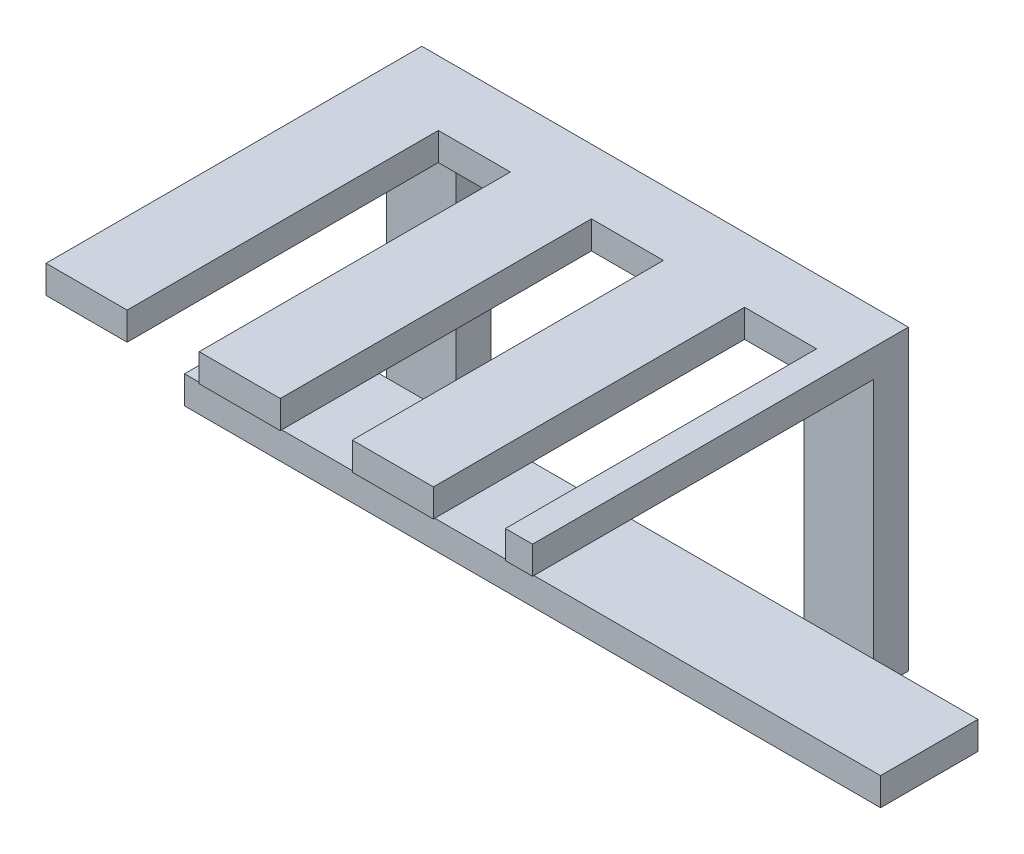
ISO-10303-21;
HEADER;
FILE_DESCRIPTION(('STEP AP214'),'2;1');
FILE_NAME('part.step','',(''),(''),'','','');
FILE_SCHEMA(('AUTOMOTIVE_DESIGN { 1 0 10303 214 1 1 1 1 }'));
ENDSEC;
DATA;
#1=APPLICATION_CONTEXT('core data for automotive mechanical design processes');
#2=APPLICATION_PROTOCOL_DEFINITION('international standard','automotive_design',2000,#1);
#3=PRODUCT_CONTEXT('',#1,'mechanical');
#4=PRODUCT('Part','Part','',(#3));
#5=PRODUCT_RELATED_PRODUCT_CATEGORY('part','',(#4));
#6=PRODUCT_DEFINITION_FORMATION('','',#4);
#7=PRODUCT_DEFINITION_CONTEXT('part definition',#1,'design');
#8=PRODUCT_DEFINITION('design','',#6,#7);
#9=PRODUCT_DEFINITION_SHAPE('','',#8);
#10=(LENGTH_UNIT() NAMED_UNIT(*) SI_UNIT(.MILLI.,.METRE.));
#11=(NAMED_UNIT(*) PLANE_ANGLE_UNIT() SI_UNIT($,.RADIAN.));
#12=(NAMED_UNIT(*) SI_UNIT($,.STERADIAN.) SOLID_ANGLE_UNIT());
#13=UNCERTAINTY_MEASURE_WITH_UNIT(LENGTH_MEASURE(1.E-05),#10,'distance_accuracy_value','');
#14=(GEOMETRIC_REPRESENTATION_CONTEXT(3) GLOBAL_UNCERTAINTY_ASSIGNED_CONTEXT((#13)) GLOBAL_UNIT_ASSIGNED_CONTEXT((#10,
#11,#12)) REPRESENTATION_CONTEXT('',''));
#15=CARTESIAN_POINT('',(0.,0.,0.));
#16=DIRECTION('',(0.,0.,1.));
#17=DIRECTION('',(1.,0.,0.));
#18=AXIS2_PLACEMENT_3D('',#15,#16,#17);
#19=CARTESIAN_POINT('',(0.,0.,42.));
#20=DIRECTION('',(0.,0.,1.));
#21=DIRECTION('',(1.,0.,0.));
#22=AXIS2_PLACEMENT_3D('',#19,#20,#21);
#23=PLANE('',#22);
#24=DIRECTION('',(0.,-1.,0.));
#25=VECTOR('',#24,1.);
#26=CARTESIAN_POINT('',(-23.2454142474019,0.,42.));
#27=LINE('',#26,#25);
#28=CARTESIAN_POINT('',(-23.2454142474019,42.8,42.));
#29=VERTEX_POINT('',#28);
#30=CARTESIAN_POINT('',(-23.2454142474019,38.8,42.));
#31=VERTEX_POINT('',#30);
#32=EDGE_CURVE('E243',#29,#31,#27,.T.);
#33=ORIENTED_EDGE('',*,*,#32,.F.);
#34=DIRECTION('',(1.,0.,0.));
#35=VECTOR('',#34,1.);
#36=CARTESIAN_POINT('',(35.,42.8,42.));
#37=LINE('',#36,#35);
#38=CARTESIAN_POINT('',(-34.9045561896725,42.8,42.));
#39=VERTEX_POINT('',#38);
#40=EDGE_CURVE('E259',#39,#29,#37,.T.);
#41=ORIENTED_EDGE('',*,*,#40,.F.);
#42=DIRECTION('',(0.,1.,0.));
#43=VECTOR('',#42,1.);
#44=CARTESIAN_POINT('',(-34.9045561896725,38.8,42.));
#45=LINE('',#44,#43);
#46=CARTESIAN_POINT('',(-34.9045561896725,38.8,42.));
#47=VERTEX_POINT('',#46);
#48=EDGE_CURVE('E284',#47,#39,#45,.T.);
#49=ORIENTED_EDGE('',*,*,#48,.F.);
#50=DIRECTION('',(-1.,0.,0.));
#51=VECTOR('',#50,1.);
#52=CARTESIAN_POINT('',(35.,38.8,42.));
#53=LINE('',#52,#51);
#54=EDGE_CURVE('E260',#31,#47,#53,.T.);
#55=ORIENTED_EDGE('',*,*,#54,.F.);
#56=EDGE_LOOP('',(#33,#41,#49,#55));
#57=FACE_BOUND('',#56,.T.);
#58=ADVANCED_FACE('F45',(#57),#23,.T.);
#59=DIRECTION('',(0.,1.,0.));
#60=VECTOR('',#59,1.);
#61=CARTESIAN_POINT('',(-12.8979257736368,0.,42.));
#62=LINE('',#61,#60);
#63=CARTESIAN_POINT('',(-12.8979257736368,38.8,42.));
#64=VERTEX_POINT('',#63);
#65=CARTESIAN_POINT('',(-12.8979257736368,42.8,42.));
#66=VERTEX_POINT('',#65);
#67=EDGE_CURVE('E263',#64,#66,#62,.T.);
#68=ORIENTED_EDGE('',*,*,#67,.F.);
#69=CARTESIAN_POINT('',(-1.24541424740194,38.8,42.));
#70=VERTEX_POINT('',#69);
#71=EDGE_CURVE('E376',#70,#64,#53,.T.);
#72=ORIENTED_EDGE('',*,*,#71,.F.);
#73=DIRECTION('',(0.,-1.,0.));
#74=VECTOR('',#73,1.);
#75=CARTESIAN_POINT('',(-1.24541424740194,0.,42.));
#76=LINE('',#75,#74);
#77=CARTESIAN_POINT('',(-1.24541424740194,42.8,42.));
#78=VERTEX_POINT('',#77);
#79=EDGE_CURVE('E421',#78,#70,#76,.T.);
#80=ORIENTED_EDGE('',*,*,#79,.F.);
#81=EDGE_CURVE('E271',#66,#78,#37,.T.);
#82=ORIENTED_EDGE('',*,*,#81,.F.);
#83=EDGE_LOOP('',(#68,#72,#80,#82));
#84=FACE_BOUND('',#83,.T.);
#85=ADVANCED_FACE('F445',(#84),#23,.T.);
#86=DIRECTION('',(0.,1.,0.));
#87=VECTOR('',#86,1.);
#88=CARTESIAN_POINT('',(9.1020742263632,0.,42.));
#89=LINE('',#88,#87);
#90=CARTESIAN_POINT('',(9.1020742263632,38.8,42.));
#91=VERTEX_POINT('',#90);
#92=CARTESIAN_POINT('',(9.1020742263632,42.8,42.));
#93=VERTEX_POINT('',#92);
#94=EDGE_CURVE('E418',#91,#93,#89,.T.);
#95=ORIENTED_EDGE('',*,*,#94,.F.);
#96=CARTESIAN_POINT('',(20.7545857525981,38.8,42.));
#97=VERTEX_POINT('',#96);
#98=EDGE_CURVE('E297',#97,#91,#53,.T.);
#99=ORIENTED_EDGE('',*,*,#98,.F.);
#100=DIRECTION('',(0.,-1.,0.));
#101=VECTOR('',#100,1.);
#102=CARTESIAN_POINT('',(20.7545857525981,0.,42.));
#103=LINE('',#102,#101);
#104=CARTESIAN_POINT('',(20.7545857525981,42.8,42.));
#105=VERTEX_POINT('',#104);
#106=EDGE_CURVE('E402',#105,#97,#103,.T.);
#107=ORIENTED_EDGE('',*,*,#106,.F.);
#108=EDGE_CURVE('E280',#93,#105,#37,.T.);
#109=ORIENTED_EDGE('',*,*,#108,.F.);
#110=EDGE_LOOP('',(#95,#99,#107,#109));
#111=FACE_BOUND('',#110,.T.);
#112=ADVANCED_FACE('F439',(#111),#23,.T.);
#113=CARTESIAN_POINT('',(-50.,4.,-7.));
#114=DIRECTION('',(0.,0.,1.));
#115=DIRECTION('',(1.,0.,0.));
#116=AXIS2_PLACEMENT_3D('',#113,#114,#115);
#117=PLANE('',#116);
#118=DIRECTION('',(0.,-1.,0.));
#119=VECTOR('',#118,1.);
#120=CARTESIAN_POINT('',(35.,4.,-7.));
#121=LINE('',#120,#119);
#122=CARTESIAN_POINT('',(35.,4.,-7.));
#123=VERTEX_POINT('',#122);
#124=CARTESIAN_POINT('',(35.,0.,-7.));
#125=VERTEX_POINT('',#124);
#126=EDGE_CURVE('E569',#123,#125,#121,.T.);
#127=ORIENTED_EDGE('',*,*,#126,.F.);
#128=DIRECTION('',(-1.,0.,0.));
#129=VECTOR('',#128,1.);
#130=CARTESIAN_POINT('',(-50.,4.,-7.));
#131=LINE('',#130,#129);
#132=CARTESIAN_POINT('',(50.,4.,-7.));
#133=VERTEX_POINT('',#132);
#134=EDGE_CURVE('E581',#133,#123,#131,.T.);
#135=ORIENTED_EDGE('',*,*,#134,.F.);
#136=DIRECTION('',(0.,-1.,0.));
#137=VECTOR('',#136,1.);
#138=CARTESIAN_POINT('',(50.,4.,-7.));
#139=LINE('',#138,#137);
#140=CARTESIAN_POINT('',(50.,0.,-7.));
#141=VERTEX_POINT('',#140);
#142=EDGE_CURVE('E396',#133,#141,#139,.T.);
#143=ORIENTED_EDGE('',*,*,#142,.T.);
#144=DIRECTION('',(-1.,0.,0.));
#145=VECTOR('',#144,1.);
#146=CARTESIAN_POINT('',(-50.,0.,-7.));
#147=LINE('',#146,#145);
#148=EDGE_CURVE('E551',#141,#125,#147,.T.);
#149=ORIENTED_EDGE('',*,*,#148,.T.);
#150=EDGE_LOOP('',(#127,#135,#143,#149));
#151=FACE_BOUND('',#150,.T.);
#152=ADVANCED_FACE('F452',(#151),#117,.F.);
#153=DIRECTION('',(0.,1.,0.));
#154=VECTOR('',#153,1.);
#155=CARTESIAN_POINT('',(25.,4.,-7.));
#156=LINE('',#155,#154);
#157=CARTESIAN_POINT('',(25.,0.,-7.));
#158=VERTEX_POINT('',#157);
#159=CARTESIAN_POINT('',(25.,4.,-7.));
#160=VERTEX_POINT('',#159);
#161=EDGE_CURVE('E661',#158,#160,#156,.T.);
#162=ORIENTED_EDGE('',*,*,#161,.F.);
#163=CARTESIAN_POINT('',(-25.,0.,-7.));
#164=VERTEX_POINT('',#163);
#165=EDGE_CURVE('E548',#158,#164,#147,.T.);
#166=ORIENTED_EDGE('',*,*,#165,.T.);
#167=DIRECTION('',(0.,-1.,0.));
#168=VECTOR('',#167,1.);
#169=CARTESIAN_POINT('',(-25.,4.,-7.));
#170=LINE('',#169,#168);
#171=CARTESIAN_POINT('',(-25.,4.,-7.));
#172=VERTEX_POINT('',#171);
#173=EDGE_CURVE('E537',#172,#164,#170,.T.);
#174=ORIENTED_EDGE('',*,*,#173,.F.);
#175=EDGE_CURVE('E585',#160,#172,#131,.T.);
#176=ORIENTED_EDGE('',*,*,#175,.F.);
#177=EDGE_LOOP('',(#162,#166,#174,#176));
#178=FACE_BOUND('',#177,.T.);
#179=ADVANCED_FACE('F513',(#178),#117,.F.);
#180=DIRECTION('',(0.,1.,0.));
#181=VECTOR('',#180,1.);
#182=CARTESIAN_POINT('',(-35.,4.,-7.));
#183=LINE('',#182,#181);
#184=CARTESIAN_POINT('',(-35.,0.,-7.));
#185=VERTEX_POINT('',#184);
#186=CARTESIAN_POINT('',(-35.,4.,-7.));
#187=VERTEX_POINT('',#186);
#188=EDGE_CURVE('E528',#185,#187,#183,.T.);
#189=ORIENTED_EDGE('',*,*,#188,.F.);
#190=CARTESIAN_POINT('',(-50.,0.,-7.));
#191=VERTEX_POINT('',#190);
#192=EDGE_CURVE('E531',#185,#191,#147,.T.);
#193=ORIENTED_EDGE('',*,*,#192,.T.);
#194=DIRECTION('',(0.,-1.,0.));
#195=VECTOR('',#194,1.);
#196=CARTESIAN_POINT('',(-50.,4.,-7.));
#197=LINE('',#196,#195);
#198=CARTESIAN_POINT('',(-50.,4.,-7.));
#199=VERTEX_POINT('',#198);
#200=EDGE_CURVE('E405',#199,#191,#197,.T.);
#201=ORIENTED_EDGE('',*,*,#200,.F.);
#202=EDGE_CURVE('E532',#187,#199,#131,.T.);
#203=ORIENTED_EDGE('',*,*,#202,.F.);
#204=EDGE_LOOP('',(#189,#193,#201,#203));
#205=FACE_BOUND('',#204,.T.);
#206=ADVANCED_FACE('F514',(#205),#117,.F.);
#207=CARTESIAN_POINT('',(50.,4.,-7.));
#208=DIRECTION('',(-1.,0.,0.));
#209=DIRECTION('',(0.,0.,1.));
#210=AXIS2_PLACEMENT_3D('',#207,#208,#209);
#211=PLANE('',#210);
#212=DIRECTION('',(0.,0.,-1.));
#213=VECTOR('',#212,1.);
#214=CARTESIAN_POINT('',(50.,0.,-7.));
#215=LINE('',#214,#213);
#216=CARTESIAN_POINT('',(50.,0.,7.));
#217=VERTEX_POINT('',#216);
#218=EDGE_CURVE('E549',#217,#141,#215,.T.);
#219=ORIENTED_EDGE('',*,*,#218,.T.);
#220=ORIENTED_EDGE('',*,*,#142,.F.);
#221=DIRECTION('',(0.,0.,-1.));
#222=VECTOR('',#221,1.);
#223=CARTESIAN_POINT('',(50.,4.,-7.));
#224=LINE('',#223,#222);
#225=CARTESIAN_POINT('',(50.,4.,7.));
#226=VERTEX_POINT('',#225);
#227=EDGE_CURVE('E576',#226,#133,#224,.T.);
#228=ORIENTED_EDGE('',*,*,#227,.F.);
#229=DIRECTION('',(0.,-1.,0.));
#230=VECTOR('',#229,1.);
#231=CARTESIAN_POINT('',(50.,4.,7.));
#232=LINE('',#231,#230);
#233=EDGE_CURVE('E591',#226,#217,#232,.T.);
#234=ORIENTED_EDGE('',*,*,#233,.T.);
#235=EDGE_LOOP('',(#219,#220,#228,#234));
#236=FACE_BOUND('',#235,.T.);
#237=ADVANCED_FACE('F47',(#236),#211,.F.);
#238=CARTESIAN_POINT('',(-50.,4.,-7.));
#239=DIRECTION('',(1.,0.,0.));
#240=DIRECTION('',(0.,0.,-1.));
#241=AXIS2_PLACEMENT_3D('',#238,#239,#240);
#242=PLANE('',#241);
#243=DIRECTION('',(0.,0.,1.));
#244=VECTOR('',#243,1.);
#245=CARTESIAN_POINT('',(-50.,0.,-7.));
#246=LINE('',#245,#244);
#247=CARTESIAN_POINT('',(-50.,0.,7.));
#248=VERTEX_POINT('',#247);
#249=EDGE_CURVE('E546',#191,#248,#246,.T.);
#250=ORIENTED_EDGE('',*,*,#249,.T.);
#251=DIRECTION('',(0.,-1.,0.));
#252=VECTOR('',#251,1.);
#253=CARTESIAN_POINT('',(-50.,4.,7.));
#254=LINE('',#253,#252);
#255=CARTESIAN_POINT('',(-50.,4.,7.));
#256=VERTEX_POINT('',#255);
#257=EDGE_CURVE('E412',#256,#248,#254,.T.);
#258=ORIENTED_EDGE('',*,*,#257,.F.);
#259=DIRECTION('',(0.,0.,1.));
#260=VECTOR('',#259,1.);
#261=CARTESIAN_POINT('',(-50.,4.,-7.));
#262=LINE('',#261,#260);
#263=EDGE_CURVE('E584',#199,#256,#262,.T.);
#264=ORIENTED_EDGE('',*,*,#263,.F.);
#265=ORIENTED_EDGE('',*,*,#200,.T.);
#266=EDGE_LOOP('',(#250,#258,#264,#265));
#267=FACE_BOUND('',#266,.T.);
#268=ADVANCED_FACE('F508',(#267),#242,.F.);
#269=CARTESIAN_POINT('',(-50.,4.,7.));
#270=DIRECTION('',(0.,0.,-1.));
#271=DIRECTION('',(-1.,0.,0.));
#272=AXIS2_PLACEMENT_3D('',#269,#270,#271);
#273=PLANE('',#272);
#274=DIRECTION('',(1.,0.,0.));
#275=VECTOR('',#274,1.);
#276=CARTESIAN_POINT('',(-50.,0.,7.));
#277=LINE('',#276,#275);
#278=EDGE_CURVE('E580',#248,#217,#277,.T.);
#279=ORIENTED_EDGE('',*,*,#278,.T.);
#280=ORIENTED_EDGE('',*,*,#233,.F.);
#281=DIRECTION('',(1.,0.,0.));
#282=VECTOR('',#281,1.);
#283=CARTESIAN_POINT('',(-50.,4.,7.));
#284=LINE('',#283,#282);
#285=EDGE_CURVE('E588',#256,#226,#284,.T.);
#286=ORIENTED_EDGE('',*,*,#285,.F.);
#287=ORIENTED_EDGE('',*,*,#257,.T.);
#288=EDGE_LOOP('',(#279,#280,#286,#287));
#289=FACE_BOUND('',#288,.T.);
#290=ADVANCED_FACE('F501',(#289),#273,.F.);
#291=CARTESIAN_POINT('',(0.,4.,0.));
#292=DIRECTION('',(0.,1.,0.));
#293=DIRECTION('',(0.,0.,1.));
#294=AXIS2_PLACEMENT_3D('',#291,#292,#293);
#295=PLANE('',#294);
#296=DIRECTION('',(1.,0.,0.));
#297=VECTOR('',#296,1.);
#298=CARTESIAN_POINT('',(-35.,4.,-7.));
#299=LINE('',#298,#297);
#300=EDGE_CURVE('E611',#187,#172,#299,.T.);
#301=ORIENTED_EDGE('',*,*,#300,.F.);
#302=ORIENTED_EDGE('',*,*,#202,.T.);
#303=ORIENTED_EDGE('',*,*,#263,.T.);
#304=ORIENTED_EDGE('',*,*,#285,.T.);
#305=ORIENTED_EDGE('',*,*,#227,.T.);
#306=ORIENTED_EDGE('',*,*,#134,.T.);
#307=DIRECTION('',(1.,0.,0.));
#308=VECTOR('',#307,1.);
#309=CARTESIAN_POINT('',(25.,4.,-7.));
#310=LINE('',#309,#308);
#311=EDGE_CURVE('E617',#160,#123,#310,.T.);
#312=ORIENTED_EDGE('',*,*,#311,.F.);
#313=ORIENTED_EDGE('',*,*,#175,.T.);
#314=EDGE_LOOP('',(#301,#302,#303,#304,#305,#306,#312,#313));
#315=FACE_BOUND('',#314,.T.);
#316=ADVANCED_FACE('F498',(#315),#295,.T.);
#317=CARTESIAN_POINT('',(0.,0.,0.));
#318=DIRECTION('',(0.,1.,0.));
#319=DIRECTION('',(0.,0.,1.));
#320=AXIS2_PLACEMENT_3D('',#317,#318,#319);
#321=PLANE('',#320);
#322=ORIENTED_EDGE('',*,*,#218,.F.);
#323=ORIENTED_EDGE('',*,*,#278,.F.);
#324=ORIENTED_EDGE('',*,*,#249,.F.);
#325=ORIENTED_EDGE('',*,*,#192,.F.);
#326=DIRECTION('',(0.,0.,1.));
#327=VECTOR('',#326,1.);
#328=CARTESIAN_POINT('',(-35.,0.,-12.));
#329=LINE('',#328,#327);
#330=CARTESIAN_POINT('',(-35.,0.,-12.));
#331=VERTEX_POINT('',#330);
#332=EDGE_CURVE('E543',#331,#185,#329,.T.);
#333=ORIENTED_EDGE('',*,*,#332,.F.);
#334=DIRECTION('',(-1.,0.,0.));
#335=VECTOR('',#334,1.);
#336=CARTESIAN_POINT('',(-25.,0.,-12.));
#337=LINE('',#336,#335);
#338=CARTESIAN_POINT('',(-25.,0.,-12.));
#339=VERTEX_POINT('',#338);
#340=EDGE_CURVE('E560',#339,#331,#337,.T.);
#341=ORIENTED_EDGE('',*,*,#340,.F.);
#342=DIRECTION('',(0.,0.,1.));
#343=VECTOR('',#342,1.);
#344=CARTESIAN_POINT('',(-25.,0.,-12.));
#345=LINE('',#344,#343);
#346=EDGE_CURVE('E556',#339,#164,#345,.T.);
#347=ORIENTED_EDGE('',*,*,#346,.T.);
#348=ORIENTED_EDGE('',*,*,#165,.F.);
#349=DIRECTION('',(0.,0.,1.));
#350=VECTOR('',#349,1.);
#351=CARTESIAN_POINT('',(25.,0.,-12.));
#352=LINE('',#351,#350);
#353=CARTESIAN_POINT('',(25.,0.,-12.));
#354=VERTEX_POINT('',#353);
#355=EDGE_CURVE('E667',#354,#158,#352,.T.);
#356=ORIENTED_EDGE('',*,*,#355,.F.);
#357=DIRECTION('',(-1.,0.,0.));
#358=VECTOR('',#357,1.);
#359=CARTESIAN_POINT('',(35.,0.,-12.));
#360=LINE('',#359,#358);
#361=CARTESIAN_POINT('',(35.,0.,-12.));
#362=VERTEX_POINT('',#361);
#363=EDGE_CURVE('E660',#362,#354,#360,.T.);
#364=ORIENTED_EDGE('',*,*,#363,.F.);
#365=DIRECTION('',(0.,0.,1.));
#366=VECTOR('',#365,1.);
#367=CARTESIAN_POINT('',(35.,0.,-12.));
#368=LINE('',#367,#366);
#369=EDGE_CURVE('E593',#362,#125,#368,.T.);
#370=ORIENTED_EDGE('',*,*,#369,.T.);
#371=ORIENTED_EDGE('',*,*,#148,.F.);
#372=EDGE_LOOP('',(#322,#323,#324,#325,#333,#341,#347,#348,#356,#364,#370,#371));
#373=FACE_BOUND('',#372,.T.);
#374=ADVANCED_FACE('F493',(#373),#321,.F.);
#375=CARTESIAN_POINT('',(-25.,4.,-12.));
#376=DIRECTION('',(-1.,0.,0.));
#377=DIRECTION('',(0.,0.,1.));
#378=AXIS2_PLACEMENT_3D('',#375,#376,#377);
#379=PLANE('',#378);
#380=ORIENTED_EDGE('',*,*,#173,.T.);
#381=ORIENTED_EDGE('',*,*,#346,.F.);
#382=DIRECTION('',(0.,-1.,0.));
#383=VECTOR('',#382,1.);
#384=CARTESIAN_POINT('',(-25.,4.,-12.));
#385=LINE('',#384,#383);
#386=CARTESIAN_POINT('',(-25.,38.8,-12.));
#387=VERTEX_POINT('',#386);
#388=EDGE_CURVE('E538',#387,#339,#385,.T.);
#389=ORIENTED_EDGE('',*,*,#388,.F.);
#390=DIRECTION('',(0.,0.,-1.));
#391=VECTOR('',#390,1.);
#392=CARTESIAN_POINT('',(-25.,38.8,-7.));
#393=LINE('',#392,#391);
#394=CARTESIAN_POINT('',(-25.,38.8,-7.));
#395=VERTEX_POINT('',#394);
#396=EDGE_CURVE('E629',#395,#387,#393,.T.);
#397=ORIENTED_EDGE('',*,*,#396,.F.);
#398=DIRECTION('',(0.,-1.,0.));
#399=VECTOR('',#398,1.);
#400=CARTESIAN_POINT('',(-25.,38.8,-7.));
#401=LINE('',#400,#399);
#402=EDGE_CURVE('E623',#395,#172,#401,.T.);
#403=ORIENTED_EDGE('',*,*,#402,.T.);
#404=EDGE_LOOP('',(#380,#381,#389,#397,#403));
#405=FACE_BOUND('',#404,.T.);
#406=ADVANCED_FACE('F490',(#405),#379,.F.);
#407=CARTESIAN_POINT('',(-35.,4.,-12.));
#408=DIRECTION('',(1.,0.,0.));
#409=DIRECTION('',(0.,0.,-1.));
#410=AXIS2_PLACEMENT_3D('',#407,#408,#409);
#411=PLANE('',#410);
#412=ORIENTED_EDGE('',*,*,#188,.T.);
#413=DIRECTION('',(0.,-1.,0.));
#414=VECTOR('',#413,1.);
#415=CARTESIAN_POINT('',(-35.,38.8,-7.));
#416=LINE('',#415,#414);
#417=CARTESIAN_POINT('',(-35.,38.8,-7.));
#418=VERTEX_POINT('',#417);
#419=EDGE_CURVE('E563',#418,#187,#416,.T.);
#420=ORIENTED_EDGE('',*,*,#419,.F.);
#421=DIRECTION('',(0.,0.,1.));
#422=VECTOR('',#421,1.);
#423=CARTESIAN_POINT('',(-35.,38.8,-7.));
#424=LINE('',#423,#422);
#425=CARTESIAN_POINT('',(-35.,38.8,-12.));
#426=VERTEX_POINT('',#425);
#427=EDGE_CURVE('E626',#426,#418,#424,.T.);
#428=ORIENTED_EDGE('',*,*,#427,.F.);
#429=DIRECTION('',(0.,1.,0.));
#430=VECTOR('',#429,1.);
#431=CARTESIAN_POINT('',(-35.,4.,-12.));
#432=LINE('',#431,#430);
#433=EDGE_CURVE('E554',#331,#426,#432,.T.);
#434=ORIENTED_EDGE('',*,*,#433,.F.);
#435=ORIENTED_EDGE('',*,*,#332,.T.);
#436=EDGE_LOOP('',(#412,#420,#428,#434,#435));
#437=FACE_BOUND('',#436,.T.);
#438=ADVANCED_FACE('F488',(#437),#411,.F.);
#439=CARTESIAN_POINT('',(35.,4.,-12.));
#440=DIRECTION('',(-1.,0.,0.));
#441=DIRECTION('',(0.,0.,1.));
#442=AXIS2_PLACEMENT_3D('',#439,#440,#441);
#443=PLANE('',#442);
#444=ORIENTED_EDGE('',*,*,#126,.T.);
#445=ORIENTED_EDGE('',*,*,#369,.F.);
#446=DIRECTION('',(0.,-1.,0.));
#447=VECTOR('',#446,1.);
#448=CARTESIAN_POINT('',(35.,4.,-12.));
#449=LINE('',#448,#447);
#450=CARTESIAN_POINT('',(35.,42.8,-12.));
#451=VERTEX_POINT('',#450);
#452=EDGE_CURVE('E656',#451,#362,#449,.T.);
#453=ORIENTED_EDGE('',*,*,#452,.F.);
#454=DIRECTION('',(0.,0.,-1.));
#455=VECTOR('',#454,1.);
#456=CARTESIAN_POINT('',(35.,42.8,42.));
#457=LINE('',#456,#455);
#458=CARTESIAN_POINT('',(35.,42.8,42.));
#459=VERTEX_POINT('',#458);
#460=EDGE_CURVE('E392',#459,#451,#457,.T.);
#461=ORIENTED_EDGE('',*,*,#460,.F.);
#462=DIRECTION('',(0.,-1.,0.));
#463=VECTOR('',#462,1.);
#464=CARTESIAN_POINT('',(35.,38.8,42.));
#465=LINE('',#464,#463);
#466=CARTESIAN_POINT('',(35.,38.8,42.));
#467=VERTEX_POINT('',#466);
#468=EDGE_CURVE('E300',#459,#467,#465,.T.);
#469=ORIENTED_EDGE('',*,*,#468,.T.);
#470=DIRECTION('',(0.,0.,-1.));
#471=VECTOR('',#470,1.);
#472=CARTESIAN_POINT('',(35.,38.8,42.));
#473=LINE('',#472,#471);
#474=CARTESIAN_POINT('',(35.,38.8,-7.));
#475=VERTEX_POINT('',#474);
#476=EDGE_CURVE('E270',#467,#475,#473,.T.);
#477=ORIENTED_EDGE('',*,*,#476,.T.);
#478=DIRECTION('',(0.,-1.,0.));
#479=VECTOR('',#478,1.);
#480=CARTESIAN_POINT('',(35.,38.8,-7.));
#481=LINE('',#480,#479);
#482=EDGE_CURVE('E642',#475,#123,#481,.T.);
#483=ORIENTED_EDGE('',*,*,#482,.T.);
#484=EDGE_LOOP('',(#444,#445,#453,#461,#469,#477,#483));
#485=FACE_BOUND('',#484,.T.);
#486=ADVANCED_FACE('F484',(#485),#443,.F.);
#487=CARTESIAN_POINT('',(25.,4.,-12.));
#488=DIRECTION('',(1.,0.,0.));
#489=DIRECTION('',(0.,0.,-1.));
#490=AXIS2_PLACEMENT_3D('',#487,#488,#489);
#491=PLANE('',#490);
#492=ORIENTED_EDGE('',*,*,#161,.T.);
#493=DIRECTION('',(0.,-1.,0.));
#494=VECTOR('',#493,1.);
#495=CARTESIAN_POINT('',(25.,38.8,-7.));
#496=LINE('',#495,#494);
#497=CARTESIAN_POINT('',(25.,38.8,-7.));
#498=VERTEX_POINT('',#497);
#499=EDGE_CURVE('E638',#498,#160,#496,.T.);
#500=ORIENTED_EDGE('',*,*,#499,.F.);
#501=DIRECTION('',(0.,0.,1.));
#502=VECTOR('',#501,1.);
#503=CARTESIAN_POINT('',(25.,38.8,-7.));
#504=LINE('',#503,#502);
#505=CARTESIAN_POINT('',(25.,38.8,-12.));
#506=VERTEX_POINT('',#505);
#507=EDGE_CURVE('E649',#506,#498,#504,.T.);
#508=ORIENTED_EDGE('',*,*,#507,.F.);
#509=DIRECTION('',(0.,1.,0.));
#510=VECTOR('',#509,1.);
#511=CARTESIAN_POINT('',(25.,4.,-12.));
#512=LINE('',#511,#510);
#513=EDGE_CURVE('E664',#354,#506,#512,.T.);
#514=ORIENTED_EDGE('',*,*,#513,.F.);
#515=ORIENTED_EDGE('',*,*,#355,.T.);
#516=EDGE_LOOP('',(#492,#500,#508,#514,#515));
#517=FACE_BOUND('',#516,.T.);
#518=ADVANCED_FACE('F480',(#517),#491,.F.);
#519=CARTESIAN_POINT('',(0.,0.,-12.));
#520=DIRECTION('',(0.,0.,-1.));
#521=DIRECTION('',(-1.,0.,0.));
#522=AXIS2_PLACEMENT_3D('',#519,#520,#521);
#523=PLANE('',#522);
#524=ORIENTED_EDGE('',*,*,#452,.T.);
#525=ORIENTED_EDGE('',*,*,#363,.T.);
#526=ORIENTED_EDGE('',*,*,#513,.T.);
#527=DIRECTION('',(-1.,0.,0.));
#528=VECTOR('',#527,1.);
#529=CARTESIAN_POINT('',(35.,38.8,-12.));
#530=LINE('',#529,#528);
#531=EDGE_CURVE('E308',#506,#387,#530,.T.);
#532=ORIENTED_EDGE('',*,*,#531,.T.);
#533=ORIENTED_EDGE('',*,*,#388,.T.);
#534=ORIENTED_EDGE('',*,*,#340,.T.);
#535=ORIENTED_EDGE('',*,*,#433,.T.);
#536=DIRECTION('',(-1.,0.,0.));
#537=VECTOR('',#536,1.);
#538=CARTESIAN_POINT('',(-35.,38.8,-12.));
#539=LINE('',#538,#537);
#540=CARTESIAN_POINT('',(-34.9045561896725,38.8,-12.));
#541=VERTEX_POINT('',#540);
#542=EDGE_CURVE('E631',#541,#426,#539,.T.);
#543=ORIENTED_EDGE('',*,*,#542,.F.);
#544=DIRECTION('',(0.,1.,0.));
#545=VECTOR('',#544,1.);
#546=CARTESIAN_POINT('',(-34.9045561896725,38.8,-12.));
#547=LINE('',#546,#545);
#548=CARTESIAN_POINT('',(-34.9045561896725,42.8,-12.));
#549=VERTEX_POINT('',#548);
#550=EDGE_CURVE('E684',#541,#549,#547,.T.);
#551=ORIENTED_EDGE('',*,*,#550,.T.);
#552=DIRECTION('',(1.,0.,0.));
#553=VECTOR('',#552,1.);
#554=CARTESIAN_POINT('',(35.,42.8,-12.));
#555=LINE('',#554,#553);
#556=EDGE_CURVE('E304',#549,#451,#555,.T.);
#557=ORIENTED_EDGE('',*,*,#556,.T.);
#558=EDGE_LOOP('',(#524,#525,#526,#532,#533,#534,#535,#543,#551,#557));
#559=FACE_BOUND('',#558,.T.);
#560=ADVANCED_FACE('F476',(#559),#523,.T.);
#561=CARTESIAN_POINT('',(25.,38.8,-7.));
#562=DIRECTION('',(0.,0.,-1.));
#563=DIRECTION('',(-1.,0.,0.));
#564=AXIS2_PLACEMENT_3D('',#561,#562,#563);
#565=PLANE('',#564);
#566=ORIENTED_EDGE('',*,*,#311,.T.);
#567=ORIENTED_EDGE('',*,*,#482,.F.);
#568=DIRECTION('',(1.,0.,0.));
#569=VECTOR('',#568,1.);
#570=CARTESIAN_POINT('',(25.,38.8,-7.));
#571=LINE('',#570,#569);
#572=EDGE_CURVE('E646',#498,#475,#571,.T.);
#573=ORIENTED_EDGE('',*,*,#572,.F.);
#574=ORIENTED_EDGE('',*,*,#499,.T.);
#575=EDGE_LOOP('',(#566,#567,#573,#574));
#576=FACE_BOUND('',#575,.T.);
#577=ADVANCED_FACE('F472',(#576),#565,.F.);
#578=CARTESIAN_POINT('',(-35.,38.8,-7.));
#579=DIRECTION('',(0.,0.,-1.));
#580=DIRECTION('',(-1.,0.,0.));
#581=AXIS2_PLACEMENT_3D('',#578,#579,#580);
#582=PLANE('',#581);
#583=ORIENTED_EDGE('',*,*,#300,.T.);
#584=ORIENTED_EDGE('',*,*,#402,.F.);
#585=DIRECTION('',(1.,0.,0.));
#586=VECTOR('',#585,1.);
#587=CARTESIAN_POINT('',(-35.,38.8,-7.));
#588=LINE('',#587,#586);
#589=CARTESIAN_POINT('',(-34.9045561896725,38.8,-7.));
#590=VERTEX_POINT('',#589);
#591=EDGE_CURVE('E697',#590,#395,#588,.T.);
#592=ORIENTED_EDGE('',*,*,#591,.F.);
#593=EDGE_CURVE('E695',#418,#590,#588,.T.);
#594=ORIENTED_EDGE('',*,*,#593,.F.);
#595=ORIENTED_EDGE('',*,*,#419,.T.);
#596=EDGE_LOOP('',(#583,#584,#592,#594,#595));
#597=FACE_BOUND('',#596,.T.);
#598=ADVANCED_FACE('F469',(#597),#582,.F.);
#599=CARTESIAN_POINT('',(0.,38.8,0.));
#600=DIRECTION('',(0.,-1.,0.));
#601=DIRECTION('',(0.,0.,-1.));
#602=AXIS2_PLACEMENT_3D('',#599,#600,#601);
#603=PLANE('',#602);
#604=ORIENTED_EDGE('',*,*,#593,.T.);
#605=DIRECTION('',(0.,0.,-1.));
#606=VECTOR('',#605,1.);
#607=CARTESIAN_POINT('',(-34.9045561896725,38.8,42.));
#608=LINE('',#607,#606);
#609=EDGE_CURVE('E388',#590,#541,#608,.T.);
#610=ORIENTED_EDGE('',*,*,#609,.T.);
#611=ORIENTED_EDGE('',*,*,#542,.T.);
#612=ORIENTED_EDGE('',*,*,#427,.T.);
#613=EDGE_LOOP('',(#604,#610,#611,#612));
#614=FACE_BOUND('',#613,.T.);
#615=ADVANCED_FACE('F462',(#614),#603,.F.);
#616=CARTESIAN_POINT('',(35.,42.8,42.));
#617=DIRECTION('',(0.,1.,0.));
#618=DIRECTION('',(0.,0.,1.));
#619=AXIS2_PLACEMENT_3D('',#616,#617,#618);
#620=PLANE('',#619);
#621=DIRECTION('',(0.,0.,1.));
#622=VECTOR('',#621,1.);
#623=CARTESIAN_POINT('',(-23.2454142474019,42.8,42.));
#624=LINE('',#623,#622);
#625=CARTESIAN_POINT('',(-23.2454142474019,42.8,-2.70732182482358));
#626=VERTEX_POINT('',#625);
#627=EDGE_CURVE('E240',#626,#29,#624,.T.);
#628=ORIENTED_EDGE('',*,*,#627,.F.);
#629=DIRECTION('',(-1.,0.,0.));
#630=VECTOR('',#629,1.);
#631=CARTESIAN_POINT('',(-23.2454142474019,42.8,-2.70732182482358));
#632=LINE('',#631,#630);
#633=CARTESIAN_POINT('',(-12.8979257736368,42.8,-2.70732182482358));
#634=VERTEX_POINT('',#633);
#635=EDGE_CURVE('E358',#634,#626,#632,.T.);
#636=ORIENTED_EDGE('',*,*,#635,.F.);
#637=DIRECTION('',(0.,0.,-1.));
#638=VECTOR('',#637,1.);
#639=CARTESIAN_POINT('',(-12.8979257736368,42.8,42.));
#640=LINE('',#639,#638);
#641=EDGE_CURVE('E252',#66,#634,#640,.T.);
#642=ORIENTED_EDGE('',*,*,#641,.F.);
#643=ORIENTED_EDGE('',*,*,#81,.T.);
#644=DIRECTION('',(0.,0.,1.));
#645=VECTOR('',#644,1.);
#646=CARTESIAN_POINT('',(-1.24541424740194,42.8,42.));
#647=LINE('',#646,#645);
#648=CARTESIAN_POINT('',(-1.24541424740194,42.8,-2.70732182482358));
#649=VERTEX_POINT('',#648);
#650=EDGE_CURVE('E347',#649,#78,#647,.T.);
#651=ORIENTED_EDGE('',*,*,#650,.F.);
#652=DIRECTION('',(-1.,0.,0.));
#653=VECTOR('',#652,1.);
#654=CARTESIAN_POINT('',(-1.24541424740194,42.8,-2.70732182482358));
#655=LINE('',#654,#653);
#656=CARTESIAN_POINT('',(9.1020742263632,42.8,-2.70732182482358));
#657=VERTEX_POINT('',#656);
#658=EDGE_CURVE('E343',#657,#649,#655,.T.);
#659=ORIENTED_EDGE('',*,*,#658,.F.);
#660=DIRECTION('',(0.,0.,-1.));
#661=VECTOR('',#660,1.);
#662=CARTESIAN_POINT('',(9.1020742263632,42.8,42.));
#663=LINE('',#662,#661);
#664=EDGE_CURVE('E253',#93,#657,#663,.T.);
#665=ORIENTED_EDGE('',*,*,#664,.F.);
#666=ORIENTED_EDGE('',*,*,#108,.T.);
#667=DIRECTION('',(0.,0.,1.));
#668=VECTOR('',#667,1.);
#669=CARTESIAN_POINT('',(20.7545857525981,42.8,42.));
#670=LINE('',#669,#668);
#671=CARTESIAN_POINT('',(20.7545857525981,42.8,-2.70732182482358));
#672=VERTEX_POINT('',#671);
#673=EDGE_CURVE('E331',#672,#105,#670,.T.);
#674=ORIENTED_EDGE('',*,*,#673,.F.);
#675=DIRECTION('',(-1.,0.,0.));
#676=VECTOR('',#675,1.);
#677=CARTESIAN_POINT('',(20.7545857525981,42.8,-2.70732182482358));
#678=LINE('',#677,#676);
#679=CARTESIAN_POINT('',(31.1020742263632,42.8,-2.70732182482358));
#680=VERTEX_POINT('',#679);
#681=EDGE_CURVE('E327',#680,#672,#678,.T.);
#682=ORIENTED_EDGE('',*,*,#681,.F.);
#683=DIRECTION('',(0.,0.,-1.));
#684=VECTOR('',#683,1.);
#685=CARTESIAN_POINT('',(31.1020742263632,42.8,42.));
#686=LINE('',#685,#684);
#687=CARTESIAN_POINT('',(31.1020742263632,42.8,42.));
#688=VERTEX_POINT('',#687);
#689=EDGE_CURVE('E322',#688,#680,#686,.T.);
#690=ORIENTED_EDGE('',*,*,#689,.F.);
#691=EDGE_CURVE('E273',#688,#459,#37,.T.);
#692=ORIENTED_EDGE('',*,*,#691,.T.);
#693=ORIENTED_EDGE('',*,*,#460,.T.);
#694=ORIENTED_EDGE('',*,*,#556,.F.);
#695=DIRECTION('',(0.,0.,-1.));
#696=VECTOR('',#695,1.);
#697=CARTESIAN_POINT('',(-34.9045561896725,42.8,42.));
#698=LINE('',#697,#696);
#699=EDGE_CURVE('E267',#39,#549,#698,.T.);
#700=ORIENTED_EDGE('',*,*,#699,.F.);
#701=ORIENTED_EDGE('',*,*,#40,.T.);
#702=EDGE_LOOP('',(#628,#636,#642,#643,#651,#659,#665,#666,#674,#682,#690,#692,#693,#694,#700,#701));
#703=FACE_BOUND('',#702,.T.);
#704=ADVANCED_FACE('F265',(#703),#620,.T.);
#705=CARTESIAN_POINT('',(-34.9045561896725,38.8,42.));
#706=DIRECTION('',(-1.,0.,0.));
#707=DIRECTION('',(0.,0.,1.));
#708=AXIS2_PLACEMENT_3D('',#705,#706,#707);
#709=PLANE('',#708);
#710=ORIENTED_EDGE('',*,*,#550,.F.);
#711=ORIENTED_EDGE('',*,*,#609,.F.);
#712=EDGE_CURVE('E277',#47,#590,#608,.T.);
#713=ORIENTED_EDGE('',*,*,#712,.F.);
#714=ORIENTED_EDGE('',*,*,#48,.T.);
#715=ORIENTED_EDGE('',*,*,#699,.T.);
#716=EDGE_LOOP('',(#710,#711,#713,#714,#715));
#717=FACE_BOUND('',#716,.T.);
#718=ADVANCED_FACE('F386',(#717),#709,.T.);
#719=CARTESIAN_POINT('',(35.,38.8,42.));
#720=DIRECTION('',(0.,-1.,0.));
#721=DIRECTION('',(0.,0.,-1.));
#722=AXIS2_PLACEMENT_3D('',#719,#720,#721);
#723=PLANE('',#722);
#724=DIRECTION('',(0.,0.,-1.));
#725=VECTOR('',#724,1.);
#726=CARTESIAN_POINT('',(-23.2454142474019,38.8,42.));
#727=LINE('',#726,#725);
#728=CARTESIAN_POINT('',(-23.2454142474019,38.8,-2.70732182482358));
#729=VERTEX_POINT('',#728);
#730=EDGE_CURVE('E305',#31,#729,#727,.T.);
#731=ORIENTED_EDGE('',*,*,#730,.F.);
#732=ORIENTED_EDGE('',*,*,#54,.T.);
#733=ORIENTED_EDGE('',*,*,#712,.T.);
#734=ORIENTED_EDGE('',*,*,#591,.T.);
#735=ORIENTED_EDGE('',*,*,#396,.T.);
#736=ORIENTED_EDGE('',*,*,#531,.F.);
#737=ORIENTED_EDGE('',*,*,#507,.T.);
#738=ORIENTED_EDGE('',*,*,#572,.T.);
#739=ORIENTED_EDGE('',*,*,#476,.F.);
#740=CARTESIAN_POINT('',(31.1020742263632,38.8,42.));
#741=VERTEX_POINT('',#740);
#742=EDGE_CURVE('E292',#467,#741,#53,.T.);
#743=ORIENTED_EDGE('',*,*,#742,.T.);
#744=DIRECTION('',(0.,0.,1.));
#745=VECTOR('',#744,1.);
#746=CARTESIAN_POINT('',(31.1020742263632,38.8,42.));
#747=LINE('',#746,#745);
#748=CARTESIAN_POINT('',(31.1020742263632,38.8,-2.70732182482358));
#749=VERTEX_POINT('',#748);
#750=EDGE_CURVE('E319',#749,#741,#747,.T.);
#751=ORIENTED_EDGE('',*,*,#750,.F.);
#752=DIRECTION('',(1.,0.,0.));
#753=VECTOR('',#752,1.);
#754=CARTESIAN_POINT('',(35.,38.8,-2.70732182482358));
#755=LINE('',#754,#753);
#756=CARTESIAN_POINT('',(20.7545857525981,38.8,-2.70732182482358));
#757=VERTEX_POINT('',#756);
#758=EDGE_CURVE('E262',#757,#749,#755,.T.);
#759=ORIENTED_EDGE('',*,*,#758,.F.);
#760=DIRECTION('',(0.,0.,-1.));
#761=VECTOR('',#760,1.);
#762=CARTESIAN_POINT('',(20.7545857525981,38.8,42.));
#763=LINE('',#762,#761);
#764=EDGE_CURVE('E316',#97,#757,#763,.T.);
#765=ORIENTED_EDGE('',*,*,#764,.F.);
#766=ORIENTED_EDGE('',*,*,#98,.T.);
#767=DIRECTION('',(0.,0.,1.));
#768=VECTOR('',#767,1.);
#769=CARTESIAN_POINT('',(9.1020742263632,38.8,42.));
#770=LINE('',#769,#768);
#771=CARTESIAN_POINT('',(9.1020742263632,38.8,-2.70732182482358));
#772=VERTEX_POINT('',#771);
#773=EDGE_CURVE('E69',#772,#91,#770,.T.);
#774=ORIENTED_EDGE('',*,*,#773,.F.);
#775=DIRECTION('',(1.,0.,0.));
#776=VECTOR('',#775,1.);
#777=CARTESIAN_POINT('',(35.,38.8,-2.70732182482358));
#778=LINE('',#777,#776);
#779=CARTESIAN_POINT('',(-1.24541424740194,38.8,-2.70732182482358));
#780=VERTEX_POINT('',#779);
#781=EDGE_CURVE('E54',#780,#772,#778,.T.);
#782=ORIENTED_EDGE('',*,*,#781,.F.);
#783=DIRECTION('',(0.,0.,-1.));
#784=VECTOR('',#783,1.);
#785=CARTESIAN_POINT('',(-1.24541424740194,38.8,42.));
#786=LINE('',#785,#784);
#787=EDGE_CURVE('E311',#70,#780,#786,.T.);
#788=ORIENTED_EDGE('',*,*,#787,.F.);
#789=ORIENTED_EDGE('',*,*,#71,.T.);
#790=DIRECTION('',(0.,0.,1.));
#791=VECTOR('',#790,1.);
#792=CARTESIAN_POINT('',(-12.8979257736368,38.8,42.));
#793=LINE('',#792,#791);
#794=CARTESIAN_POINT('',(-12.8979257736368,38.8,-2.70732182482358));
#795=VERTEX_POINT('',#794);
#796=EDGE_CURVE('E61',#795,#64,#793,.T.);
#797=ORIENTED_EDGE('',*,*,#796,.F.);
#798=DIRECTION('',(1.,0.,0.));
#799=VECTOR('',#798,1.);
#800=CARTESIAN_POINT('',(35.,38.8,-2.70732182482358));
#801=LINE('',#800,#799);
#802=EDGE_CURVE('E11',#729,#795,#801,.T.);
#803=ORIENTED_EDGE('',*,*,#802,.F.);
#804=EDGE_LOOP('',(#731,#732,#733,#734,#735,#736,#737,#738,#739,#743,#751,#759,#765,#766,#774,
#782,#788,#789,#797,#803));
#805=FACE_BOUND('',#804,.T.);
#806=ADVANCED_FACE('F372',(#805),#723,.T.);
#807=DIRECTION('',(0.,1.,0.));
#808=VECTOR('',#807,1.);
#809=CARTESIAN_POINT('',(31.1020742263632,0.,42.));
#810=LINE('',#809,#808);
#811=EDGE_CURVE('E395',#741,#688,#810,.T.);
#812=ORIENTED_EDGE('',*,*,#811,.F.);
#813=ORIENTED_EDGE('',*,*,#742,.F.);
#814=ORIENTED_EDGE('',*,*,#468,.F.);
#815=ORIENTED_EDGE('',*,*,#691,.F.);
#816=EDGE_LOOP('',(#812,#813,#814,#815));
#817=FACE_BOUND('',#816,.T.);
#818=ADVANCED_FACE('F453',(#817),#23,.T.);
#819=CARTESIAN_POINT('',(20.7545857525981,28.8,42.));
#820=DIRECTION('',(-1.,0.,0.));
#821=DIRECTION('',(0.,0.,1.));
#822=AXIS2_PLACEMENT_3D('',#819,#820,#821);
#823=PLANE('',#822);
#824=ORIENTED_EDGE('',*,*,#764,.T.);
#825=DIRECTION('',(0.,1.,0.));
#826=VECTOR('',#825,1.);
#827=CARTESIAN_POINT('',(20.7545857525981,28.8,-2.70732182482358));
#828=LINE('',#827,#826);
#829=EDGE_CURVE('E335',#757,#672,#828,.T.);
#830=ORIENTED_EDGE('',*,*,#829,.T.);
#831=ORIENTED_EDGE('',*,*,#673,.T.);
#832=ORIENTED_EDGE('',*,*,#106,.T.);
#833=EDGE_LOOP('',(#824,#830,#831,#832));
#834=FACE_BOUND('',#833,.T.);
#835=ADVANCED_FACE('F457',(#834),#823,.F.);
#836=CARTESIAN_POINT('',(20.7545857525981,28.8,-2.70732182482358));
#837=DIRECTION('',(0.,0.,-1.));
#838=DIRECTION('',(-1.,0.,0.));
#839=AXIS2_PLACEMENT_3D('',#836,#837,#838);
#840=PLANE('',#839);
#841=ORIENTED_EDGE('',*,*,#758,.T.);
#842=DIRECTION('',(0.,1.,0.));
#843=VECTOR('',#842,1.);
#844=CARTESIAN_POINT('',(31.1020742263632,28.8,-2.70732182482358));
#845=LINE('',#844,#843);
#846=EDGE_CURVE('E334',#749,#680,#845,.T.);
#847=ORIENTED_EDGE('',*,*,#846,.T.);
#848=ORIENTED_EDGE('',*,*,#681,.T.);
#849=ORIENTED_EDGE('',*,*,#829,.F.);
#850=EDGE_LOOP('',(#841,#847,#848,#849));
#851=FACE_BOUND('',#850,.T.);
#852=ADVANCED_FACE('F713',(#851),#840,.F.);
#853=CARTESIAN_POINT('',(31.1020742263632,28.8,42.));
#854=DIRECTION('',(1.,0.,0.));
#855=DIRECTION('',(0.,0.,-1.));
#856=AXIS2_PLACEMENT_3D('',#853,#854,#855);
#857=PLANE('',#856);
#858=ORIENTED_EDGE('',*,*,#750,.T.);
#859=ORIENTED_EDGE('',*,*,#811,.T.);
#860=ORIENTED_EDGE('',*,*,#689,.T.);
#861=ORIENTED_EDGE('',*,*,#846,.F.);
#862=EDGE_LOOP('',(#858,#859,#860,#861));
#863=FACE_BOUND('',#862,.T.);
#864=ADVANCED_FACE('F710',(#863),#857,.F.);
#865=CARTESIAN_POINT('',(-1.24541424740194,28.8,42.));
#866=DIRECTION('',(-1.,0.,0.));
#867=DIRECTION('',(0.,0.,1.));
#868=AXIS2_PLACEMENT_3D('',#865,#866,#867);
#869=PLANE('',#868);
#870=ORIENTED_EDGE('',*,*,#787,.T.);
#871=DIRECTION('',(0.,1.,0.));
#872=VECTOR('',#871,1.);
#873=CARTESIAN_POINT('',(-1.24541424740194,28.8,-2.70732182482358));
#874=LINE('',#873,#872);
#875=EDGE_CURVE('E326',#780,#649,#874,.T.);
#876=ORIENTED_EDGE('',*,*,#875,.T.);
#877=ORIENTED_EDGE('',*,*,#650,.T.);
#878=ORIENTED_EDGE('',*,*,#79,.T.);
#879=EDGE_LOOP('',(#870,#876,#877,#878));
#880=FACE_BOUND('',#879,.T.);
#881=ADVANCED_FACE('F444',(#880),#869,.F.);
#882=CARTESIAN_POINT('',(-1.24541424740194,28.8,-2.70732182482358));
#883=DIRECTION('',(0.,0.,-1.));
#884=DIRECTION('',(-1.,0.,0.));
#885=AXIS2_PLACEMENT_3D('',#882,#883,#884);
#886=PLANE('',#885);
#887=ORIENTED_EDGE('',*,*,#781,.T.);
#888=DIRECTION('',(0.,1.,0.));
#889=VECTOR('',#888,1.);
#890=CARTESIAN_POINT('',(9.1020742263632,28.8,-2.70732182482358));
#891=LINE('',#890,#889);
#892=EDGE_CURVE('E350',#772,#657,#891,.T.);
#893=ORIENTED_EDGE('',*,*,#892,.T.);
#894=ORIENTED_EDGE('',*,*,#658,.T.);
#895=ORIENTED_EDGE('',*,*,#875,.F.);
#896=EDGE_LOOP('',(#887,#893,#894,#895));
#897=FACE_BOUND('',#896,.T.);
#898=ADVANCED_FACE('F430',(#897),#886,.F.);
#899=CARTESIAN_POINT('',(9.1020742263632,28.8,42.));
#900=DIRECTION('',(1.,0.,0.));
#901=DIRECTION('',(0.,0.,-1.));
#902=AXIS2_PLACEMENT_3D('',#899,#900,#901);
#903=PLANE('',#902);
#904=ORIENTED_EDGE('',*,*,#773,.T.);
#905=ORIENTED_EDGE('',*,*,#94,.T.);
#906=ORIENTED_EDGE('',*,*,#664,.T.);
#907=ORIENTED_EDGE('',*,*,#892,.F.);
#908=EDGE_LOOP('',(#904,#905,#906,#907));
#909=FACE_BOUND('',#908,.T.);
#910=ADVANCED_FACE('F431',(#909),#903,.F.);
#911=CARTESIAN_POINT('',(-23.2454142474019,28.8,42.));
#912=DIRECTION('',(-1.,0.,0.));
#913=DIRECTION('',(0.,0.,1.));
#914=AXIS2_PLACEMENT_3D('',#911,#912,#913);
#915=PLANE('',#914);
#916=ORIENTED_EDGE('',*,*,#730,.T.);
#917=DIRECTION('',(0.,1.,0.));
#918=VECTOR('',#917,1.);
#919=CARTESIAN_POINT('',(-23.2454142474019,28.8,-2.70732182482358));
#920=LINE('',#919,#918);
#921=EDGE_CURVE('E246',#729,#626,#920,.T.);
#922=ORIENTED_EDGE('',*,*,#921,.T.);
#923=ORIENTED_EDGE('',*,*,#627,.T.);
#924=ORIENTED_EDGE('',*,*,#32,.T.);
#925=EDGE_LOOP('',(#916,#922,#923,#924));
#926=FACE_BOUND('',#925,.T.);
#927=ADVANCED_FACE('F242',(#926),#915,.F.);
#928=CARTESIAN_POINT('',(-23.2454142474019,28.8,-2.70732182482358));
#929=DIRECTION('',(0.,0.,-1.));
#930=DIRECTION('',(-1.,0.,0.));
#931=AXIS2_PLACEMENT_3D('',#928,#929,#930);
#932=PLANE('',#931);
#933=ORIENTED_EDGE('',*,*,#802,.T.);
#934=DIRECTION('',(0.,1.,0.));
#935=VECTOR('',#934,1.);
#936=CARTESIAN_POINT('',(-12.8979257736368,28.8,-2.70732182482358));
#937=LINE('',#936,#935);
#938=EDGE_CURVE('E355',#795,#634,#937,.T.);
#939=ORIENTED_EDGE('',*,*,#938,.T.);
#940=ORIENTED_EDGE('',*,*,#635,.T.);
#941=ORIENTED_EDGE('',*,*,#921,.F.);
#942=EDGE_LOOP('',(#933,#939,#940,#941));
#943=FACE_BOUND('',#942,.T.);
#944=ADVANCED_FACE('F369',(#943),#932,.F.);
#945=CARTESIAN_POINT('',(-12.8979257736368,28.8,42.));
#946=DIRECTION('',(1.,0.,0.));
#947=DIRECTION('',(0.,0.,-1.));
#948=AXIS2_PLACEMENT_3D('',#945,#946,#947);
#949=PLANE('',#948);
#950=ORIENTED_EDGE('',*,*,#796,.T.);
#951=ORIENTED_EDGE('',*,*,#67,.T.);
#952=ORIENTED_EDGE('',*,*,#641,.T.);
#953=ORIENTED_EDGE('',*,*,#938,.F.);
#954=EDGE_LOOP('',(#950,#951,#952,#953));
#955=FACE_BOUND('',#954,.T.);
#956=ADVANCED_FACE('F366',(#955),#949,.F.);
#957=CLOSED_SHELL('',(#58,#85,#112,#152,#179,#206,#237,#268,#290,#316,#374,#406,#438,#486,#518,
#560,#577,#598,#615,#704,#718,#806,#818,#835,#852,#864,#881,#898,#910,#927,#944,#956));
#958=MANIFOLD_SOLID_BREP('B2',#957);
#959=ADVANCED_BREP_SHAPE_REPRESENTATION('',(#18,#958),#14);
#960=SHAPE_DEFINITION_REPRESENTATION(#9,#959);
ENDSEC;
END-ISO-10303-21;
